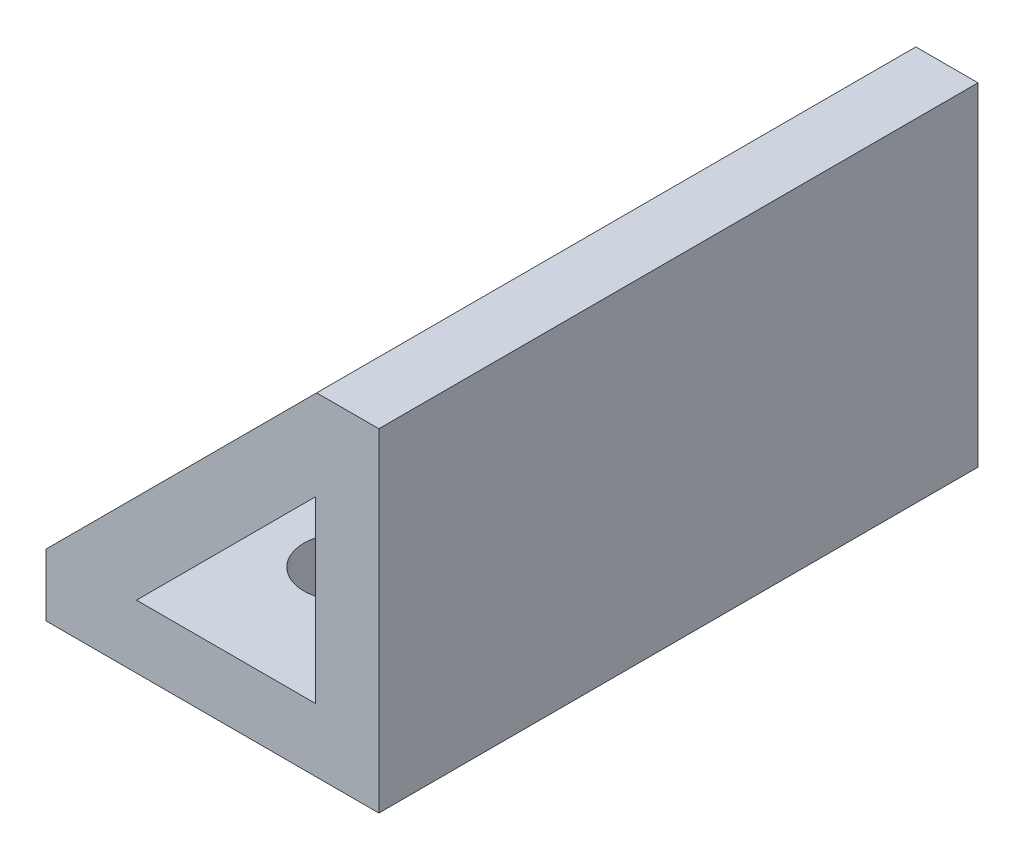
ISO-10303-21;
HEADER;
FILE_DESCRIPTION(('STEP AP214'),'2;1');
FILE_NAME('part.step','',(''),(''),'','','');
FILE_SCHEMA(('AUTOMOTIVE_DESIGN { 1 0 10303 214 1 1 1 1 }'));
ENDSEC;
DATA;
#1=APPLICATION_CONTEXT('core data for automotive mechanical design processes');
#2=APPLICATION_PROTOCOL_DEFINITION('international standard','automotive_design',2000,#1);
#3=PRODUCT_CONTEXT('',#1,'mechanical');
#4=PRODUCT('Part','Part','',(#3));
#5=PRODUCT_RELATED_PRODUCT_CATEGORY('part','',(#4));
#6=PRODUCT_DEFINITION_FORMATION('','',#4);
#7=PRODUCT_DEFINITION_CONTEXT('part definition',#1,'design');
#8=PRODUCT_DEFINITION('design','',#6,#7);
#9=PRODUCT_DEFINITION_SHAPE('','',#8);
#10=(LENGTH_UNIT() NAMED_UNIT(*) SI_UNIT(.MILLI.,.METRE.));
#11=(NAMED_UNIT(*) PLANE_ANGLE_UNIT() SI_UNIT($,.RADIAN.));
#12=(NAMED_UNIT(*) SI_UNIT($,.STERADIAN.) SOLID_ANGLE_UNIT());
#13=UNCERTAINTY_MEASURE_WITH_UNIT(LENGTH_MEASURE(1.E-05),#10,'distance_accuracy_value','');
#14=(GEOMETRIC_REPRESENTATION_CONTEXT(3) GLOBAL_UNCERTAINTY_ASSIGNED_CONTEXT((#13)) GLOBAL_UNIT_ASSIGNED_CONTEXT((#10,
#11,#12)) REPRESENTATION_CONTEXT('',''));
#15=CARTESIAN_POINT('',(0.,0.,0.));
#16=DIRECTION('',(0.,0.,1.));
#17=DIRECTION('',(1.,0.,0.));
#18=AXIS2_PLACEMENT_3D('',#15,#16,#17);
#19=CARTESIAN_POINT('',(0.,0.,45.72));
#20=DIRECTION('',(0.,0.,-1.));
#21=DIRECTION('',(-1.,0.,0.));
#22=AXIS2_PLACEMENT_3D('',#19,#20,#21);
#23=PLANE('',#22);
#24=DIRECTION('',(-1.,0.,0.));
#25=VECTOR('',#24,1.);
#26=CARTESIAN_POINT('',(-4.74541092154095,25.4,45.72));
#27=LINE('',#26,#25);
#28=CARTESIAN_POINT('',(0.,25.4,45.72));
#29=VERTEX_POINT('',#28);
#30=CARTESIAN_POINT('',(-4.74541092154095,25.4,45.72));
#31=VERTEX_POINT('',#30);
#32=EDGE_CURVE('E158',#29,#31,#27,.T.);
#33=ORIENTED_EDGE('',*,*,#32,.T.);
#34=DIRECTION('',(-0.707106781186548,-0.707106781186548,0.));
#35=VECTOR('',#34,1.);
#36=CARTESIAN_POINT('',(-4.74541092154095,25.4,45.72));
#37=LINE('',#36,#35);
#38=CARTESIAN_POINT('',(-25.4,4.74541092154095,45.72));
#39=VERTEX_POINT('',#38);
#40=EDGE_CURVE('E161',#31,#39,#37,.T.);
#41=ORIENTED_EDGE('',*,*,#40,.T.);
#42=DIRECTION('',(0.,-1.,0.));
#43=VECTOR('',#42,1.);
#44=CARTESIAN_POINT('',(-25.4,0.,45.72));
#45=LINE('',#44,#43);
#46=CARTESIAN_POINT('',(-25.4,0.,45.72));
#47=VERTEX_POINT('',#46);
#48=EDGE_CURVE('E164',#39,#47,#45,.T.);
#49=ORIENTED_EDGE('',*,*,#48,.T.);
#50=DIRECTION('',(1.,0.,0.));
#51=VECTOR('',#50,1.);
#52=CARTESIAN_POINT('',(0.,0.,45.72));
#53=LINE('',#52,#51);
#54=CARTESIAN_POINT('',(0.,0.,45.72));
#55=VERTEX_POINT('',#54);
#56=EDGE_CURVE('E166',#47,#55,#53,.T.);
#57=ORIENTED_EDGE('',*,*,#56,.T.);
#58=DIRECTION('',(0.,1.,0.));
#59=VECTOR('',#58,1.);
#60=CARTESIAN_POINT('',(0.,25.4,45.72));
#61=LINE('',#60,#59);
#62=EDGE_CURVE('E168',#55,#29,#61,.T.);
#63=ORIENTED_EDGE('',*,*,#62,.T.);
#64=EDGE_LOOP('',(#33,#41,#49,#57,#63));
#65=FACE_BOUND('',#64,.T.);
#66=DIRECTION('',(-0.707106781186547,-0.707106781186548,0.));
#67=VECTOR('',#66,1.);
#68=CARTESIAN_POINT('',(-18.4944162695284,4.826,45.72));
#69=LINE('',#68,#67);
#70=CARTESIAN_POINT('',(-4.826,18.4944162695284,45.72));
#71=VERTEX_POINT('',#70);
#72=CARTESIAN_POINT('',(-18.4944162695284,4.826,45.72));
#73=VERTEX_POINT('',#72);
#74=EDGE_CURVE('E149',#71,#73,#69,.T.);
#75=ORIENTED_EDGE('',*,*,#74,.F.);
#76=DIRECTION('',(0.,1.,0.));
#77=VECTOR('',#76,1.);
#78=CARTESIAN_POINT('',(-4.826,18.4944162695284,45.72));
#79=LINE('',#78,#77);
#80=CARTESIAN_POINT('',(-4.826,4.826,45.72));
#81=VERTEX_POINT('',#80);
#82=EDGE_CURVE('E145',#81,#71,#79,.T.);
#83=ORIENTED_EDGE('',*,*,#82,.F.);
#84=DIRECTION('',(1.,0.,0.));
#85=VECTOR('',#84,1.);
#86=CARTESIAN_POINT('',(-4.826,4.826,45.72));
#87=LINE('',#86,#85);
#88=EDGE_CURVE('E151',#73,#81,#87,.T.);
#89=ORIENTED_EDGE('',*,*,#88,.F.);
#90=EDGE_LOOP('',(#75,#83,#89));
#91=FACE_BOUND('',#90,.T.);
#92=ADVANCED_FACE('F33',(#65,#91),#23,.F.);
#93=CARTESIAN_POINT('',(0.,0.,0.));
#94=DIRECTION('',(0.,0.,-1.));
#95=DIRECTION('',(-1.,0.,0.));
#96=AXIS2_PLACEMENT_3D('',#93,#94,#95);
#97=PLANE('',#96);
#98=DIRECTION('',(-1.,0.,0.));
#99=VECTOR('',#98,1.);
#100=CARTESIAN_POINT('',(-4.74541092154095,25.4,0.));
#101=LINE('',#100,#99);
#102=CARTESIAN_POINT('',(0.,25.4,0.));
#103=VERTEX_POINT('',#102);
#104=CARTESIAN_POINT('',(-4.74541092154095,25.4,0.));
#105=VERTEX_POINT('',#104);
#106=EDGE_CURVE('E157',#103,#105,#101,.T.);
#107=ORIENTED_EDGE('',*,*,#106,.F.);
#108=DIRECTION('',(0.,1.,0.));
#109=VECTOR('',#108,1.);
#110=CARTESIAN_POINT('',(0.,25.4,0.));
#111=LINE('',#110,#109);
#112=CARTESIAN_POINT('',(0.,0.,0.));
#113=VERTEX_POINT('',#112);
#114=EDGE_CURVE('E162',#113,#103,#111,.T.);
#115=ORIENTED_EDGE('',*,*,#114,.F.);
#116=DIRECTION('',(1.,0.,0.));
#117=VECTOR('',#116,1.);
#118=CARTESIAN_POINT('',(0.,0.,0.));
#119=LINE('',#118,#117);
#120=CARTESIAN_POINT('',(-25.4,0.,0.));
#121=VERTEX_POINT('',#120);
#122=EDGE_CURVE('E177',#121,#113,#119,.T.);
#123=ORIENTED_EDGE('',*,*,#122,.F.);
#124=DIRECTION('',(0.,-1.,0.));
#125=VECTOR('',#124,1.);
#126=CARTESIAN_POINT('',(-25.4,0.,0.));
#127=LINE('',#126,#125);
#128=CARTESIAN_POINT('',(-25.4,4.74541092154095,0.));
#129=VERTEX_POINT('',#128);
#130=EDGE_CURVE('E175',#129,#121,#127,.T.);
#131=ORIENTED_EDGE('',*,*,#130,.F.);
#132=DIRECTION('',(-0.707106781186548,-0.707106781186548,0.));
#133=VECTOR('',#132,1.);
#134=CARTESIAN_POINT('',(-4.74541092154095,25.4,0.));
#135=LINE('',#134,#133);
#136=EDGE_CURVE('E173',#105,#129,#135,.T.);
#137=ORIENTED_EDGE('',*,*,#136,.F.);
#138=EDGE_LOOP('',(#107,#115,#123,#131,#137));
#139=FACE_BOUND('',#138,.T.);
#140=DIRECTION('',(0.,1.,0.));
#141=VECTOR('',#140,1.);
#142=CARTESIAN_POINT('',(-4.826,18.4944162695284,0.));
#143=LINE('',#142,#141);
#144=CARTESIAN_POINT('',(-4.826,4.826,0.));
#145=VERTEX_POINT('',#144);
#146=CARTESIAN_POINT('',(-4.826,18.4944162695284,0.));
#147=VERTEX_POINT('',#146);
#148=EDGE_CURVE('E143',#145,#147,#143,.T.);
#149=ORIENTED_EDGE('',*,*,#148,.T.);
#150=DIRECTION('',(-0.707106781186547,-0.707106781186548,0.));
#151=VECTOR('',#150,1.);
#152=CARTESIAN_POINT('',(-18.4944162695284,4.826,0.));
#153=LINE('',#152,#151);
#154=CARTESIAN_POINT('',(-18.4944162695284,4.826,0.));
#155=VERTEX_POINT('',#154);
#156=EDGE_CURVE('E128',#147,#155,#153,.T.);
#157=ORIENTED_EDGE('',*,*,#156,.T.);
#158=DIRECTION('',(1.,0.,0.));
#159=VECTOR('',#158,1.);
#160=CARTESIAN_POINT('',(-4.826,4.826,0.));
#161=LINE('',#160,#159);
#162=EDGE_CURVE('E137',#155,#145,#161,.T.);
#163=ORIENTED_EDGE('',*,*,#162,.T.);
#164=EDGE_LOOP('',(#149,#157,#163));
#165=FACE_BOUND('',#164,.T.);
#166=ADVANCED_FACE('F148',(#139,#165),#97,.T.);
#167=CARTESIAN_POINT('',(-4.74541092154095,25.4,45.72));
#168=DIRECTION('',(0.,-1.,0.));
#169=DIRECTION('',(0.,0.,-1.));
#170=AXIS2_PLACEMENT_3D('',#167,#168,#169);
#171=PLANE('',#170);
#172=ORIENTED_EDGE('',*,*,#106,.T.);
#173=DIRECTION('',(0.,0.,-1.));
#174=VECTOR('',#173,1.);
#175=CARTESIAN_POINT('',(-4.74541092154095,25.4,45.72));
#176=LINE('',#175,#174);
#177=EDGE_CURVE('E191',#31,#105,#176,.T.);
#178=ORIENTED_EDGE('',*,*,#177,.F.);
#179=ORIENTED_EDGE('',*,*,#32,.F.);
#180=DIRECTION('',(0.,0.,-1.));
#181=VECTOR('',#180,1.);
#182=CARTESIAN_POINT('',(0.,25.4,45.72));
#183=LINE('',#182,#181);
#184=EDGE_CURVE('E170',#29,#103,#183,.T.);
#185=ORIENTED_EDGE('',*,*,#184,.T.);
#186=EDGE_LOOP('',(#172,#178,#179,#185));
#187=FACE_BOUND('',#186,.T.);
#188=ADVANCED_FACE('F35',(#187),#171,.F.);
#189=CARTESIAN_POINT('',(-4.74541092154095,25.4,45.72));
#190=DIRECTION('',(0.707106781186548,-0.707106781186548,0.));
#191=DIRECTION('',(0.707106781186548,0.707106781186548,0.));
#192=AXIS2_PLACEMENT_3D('',#189,#190,#191);
#193=PLANE('',#192);
#194=CARTESIAN_POINT('',(-12.7,17.4454109215409,35.56));
#195=DIRECTION('',(0.707106781186548,-0.707106781186548,0.));
#196=DIRECTION('',(0.707106781186548,0.707106781186548,0.));
#197=AXIS2_PLACEMENT_3D('',#194,#195,#196);
#198=ELLIPSE('',#197,8.98025612106915,6.35);
#199=CARTESIAN_POINT('',(-6.35,23.795410921541,35.56));
#200=VERTEX_POINT('',#199);
#201=EDGE_CURVE('E114',#200,#200,#198,.T.);
#202=ORIENTED_EDGE('',*,*,#201,.T.);
#203=EDGE_LOOP('',(#202));
#204=FACE_BOUND('',#203,.T.);
#205=CARTESIAN_POINT('',(-12.7,17.4454109215409,10.16));
#206=DIRECTION('',(0.707106781186548,-0.707106781186548,0.));
#207=DIRECTION('',(0.707106781186548,0.707106781186548,0.));
#208=AXIS2_PLACEMENT_3D('',#205,#206,#207);
#209=ELLIPSE('',#208,8.98025612106915,6.35);
#210=CARTESIAN_POINT('',(-6.35,23.795410921541,10.16));
#211=VERTEX_POINT('',#210);
#212=EDGE_CURVE('E250',#211,#211,#209,.T.);
#213=ORIENTED_EDGE('',*,*,#212,.T.);
#214=EDGE_LOOP('',(#213));
#215=FACE_BOUND('',#214,.T.);
#216=ORIENTED_EDGE('',*,*,#136,.T.);
#217=DIRECTION('',(0.,0.,-1.));
#218=VECTOR('',#217,1.);
#219=CARTESIAN_POINT('',(-25.4,4.74541092154095,45.72));
#220=LINE('',#219,#218);
#221=EDGE_CURVE('E188',#39,#129,#220,.T.);
#222=ORIENTED_EDGE('',*,*,#221,.F.);
#223=ORIENTED_EDGE('',*,*,#40,.F.);
#224=ORIENTED_EDGE('',*,*,#177,.T.);
#225=EDGE_LOOP('',(#216,#222,#223,#224));
#226=FACE_BOUND('',#225,.T.);
#227=ADVANCED_FACE('F236',(#204,#215,#226),#193,.F.);
#228=CARTESIAN_POINT('',(-25.4,0.,45.72));
#229=DIRECTION('',(1.,0.,0.));
#230=DIRECTION('',(0.,0.,-1.));
#231=AXIS2_PLACEMENT_3D('',#228,#229,#230);
#232=PLANE('',#231);
#233=ORIENTED_EDGE('',*,*,#130,.T.);
#234=DIRECTION('',(0.,0.,-1.));
#235=VECTOR('',#234,1.);
#236=CARTESIAN_POINT('',(-25.4,0.,45.72));
#237=LINE('',#236,#235);
#238=EDGE_CURVE('E185',#47,#121,#237,.T.);
#239=ORIENTED_EDGE('',*,*,#238,.F.);
#240=ORIENTED_EDGE('',*,*,#48,.F.);
#241=ORIENTED_EDGE('',*,*,#221,.T.);
#242=EDGE_LOOP('',(#233,#239,#240,#241));
#243=FACE_BOUND('',#242,.T.);
#244=ADVANCED_FACE('F233',(#243),#232,.F.);
#245=CARTESIAN_POINT('',(0.,0.,45.72));
#246=DIRECTION('',(0.,1.,0.));
#247=DIRECTION('',(0.,0.,1.));
#248=AXIS2_PLACEMENT_3D('',#245,#246,#247);
#249=PLANE('',#248);
#250=CARTESIAN_POINT('',(-12.7,0.,10.16));
#251=DIRECTION('',(0.,-1.,0.));
#252=DIRECTION('',(0.,0.,-1.));
#253=AXIS2_PLACEMENT_3D('',#250,#251,#252);
#254=CIRCLE('',#253,3.175);
#255=CARTESIAN_POINT('',(-12.7,0.,6.98499999999999));
#256=VERTEX_POINT('',#255);
#257=EDGE_CURVE('E201',#256,#256,#254,.T.);
#258=ORIENTED_EDGE('',*,*,#257,.F.);
#259=EDGE_LOOP('',(#258));
#260=FACE_BOUND('',#259,.T.);
#261=CARTESIAN_POINT('',(-12.7,0.,35.56));
#262=DIRECTION('',(0.,-1.,0.));
#263=DIRECTION('',(0.,0.,-1.));
#264=AXIS2_PLACEMENT_3D('',#261,#262,#263);
#265=CIRCLE('',#264,3.175);
#266=CARTESIAN_POINT('',(-12.7,0.,32.385));
#267=VERTEX_POINT('',#266);
#268=EDGE_CURVE('E197',#267,#267,#265,.T.);
#269=ORIENTED_EDGE('',*,*,#268,.F.);
#270=EDGE_LOOP('',(#269));
#271=FACE_BOUND('',#270,.T.);
#272=ORIENTED_EDGE('',*,*,#122,.T.);
#273=DIRECTION('',(0.,0.,-1.));
#274=VECTOR('',#273,1.);
#275=CARTESIAN_POINT('',(0.,0.,45.72));
#276=LINE('',#275,#274);
#277=EDGE_CURVE('E182',#55,#113,#276,.T.);
#278=ORIENTED_EDGE('',*,*,#277,.F.);
#279=ORIENTED_EDGE('',*,*,#56,.F.);
#280=ORIENTED_EDGE('',*,*,#238,.T.);
#281=EDGE_LOOP('',(#272,#278,#279,#280));
#282=FACE_BOUND('',#281,.T.);
#283=ADVANCED_FACE('F229',(#260,#271,#282),#249,.F.);
#284=CARTESIAN_POINT('',(0.,25.4,45.72));
#285=DIRECTION('',(-1.,0.,0.));
#286=DIRECTION('',(0.,-1.,0.));
#287=AXIS2_PLACEMENT_3D('',#284,#285,#286);
#288=PLANE('',#287);
#289=ORIENTED_EDGE('',*,*,#114,.T.);
#290=ORIENTED_EDGE('',*,*,#184,.F.);
#291=ORIENTED_EDGE('',*,*,#62,.F.);
#292=ORIENTED_EDGE('',*,*,#277,.T.);
#293=EDGE_LOOP('',(#289,#290,#291,#292));
#294=FACE_BOUND('',#293,.T.);
#295=ADVANCED_FACE('F120',(#294),#288,.F.);
#296=CARTESIAN_POINT('',(-18.4944162695284,4.826,45.72));
#297=DIRECTION('',(0.707106781186548,-0.707106781186547,0.));
#298=DIRECTION('',(0.707106781186547,0.707106781186548,0.));
#299=AXIS2_PLACEMENT_3D('',#296,#297,#298);
#300=PLANE('',#299);
#301=CARTESIAN_POINT('',(-12.7,10.6204162695284,35.56));
#302=DIRECTION('',(0.707106781186548,-0.707106781186547,0.));
#303=DIRECTION('',(0.707106781186547,0.707106781186548,0.));
#304=AXIS2_PLACEMENT_3D('',#301,#302,#303);
#305=ELLIPSE('',#304,8.98025612106916,6.35);
#306=CARTESIAN_POINT('',(-16.9704162695284,6.35,30.8604207757558));
#307=VERTEX_POINT('',#306);
#308=CARTESIAN_POINT('',(-16.9704162695284,6.35,40.2595792242441));
#309=VERTEX_POINT('',#308);
#310=EDGE_CURVE('E11',#307,#309,#305,.T.);
#311=ORIENTED_EDGE('',*,*,#310,.F.);
#312=DIRECTION('',(0.,0.,1.));
#313=VECTOR('',#312,1.);
#314=CARTESIAN_POINT('',(-16.9704162695284,6.35,45.72));
#315=LINE('',#314,#313);
#316=EDGE_CURVE('E41',#307,#309,#315,.T.);
#317=ORIENTED_EDGE('',*,*,#316,.T.);
#318=EDGE_LOOP('',(#311,#317));
#319=FACE_BOUND('',#318,.T.);
#320=CARTESIAN_POINT('',(-12.7,10.6204162695284,10.16));
#321=DIRECTION('',(0.707106781186548,-0.707106781186547,0.));
#322=DIRECTION('',(0.707106781186547,0.707106781186548,0.));
#323=AXIS2_PLACEMENT_3D('',#320,#321,#322);
#324=ELLIPSE('',#323,8.98025612106916,6.35);
#325=CARTESIAN_POINT('',(-16.9704162695284,6.35,5.46042077575585));
#326=VERTEX_POINT('',#325);
#327=CARTESIAN_POINT('',(-16.9704162695284,6.35,14.8595792242441));
#328=VERTEX_POINT('',#327);
#329=EDGE_CURVE('E110',#326,#328,#324,.T.);
#330=ORIENTED_EDGE('',*,*,#329,.F.);
#331=DIRECTION('',(0.,0.,1.));
#332=VECTOR('',#331,1.);
#333=CARTESIAN_POINT('',(-16.9704162695284,6.35,45.72));
#334=LINE('',#333,#332);
#335=EDGE_CURVE('E194',#326,#328,#334,.T.);
#336=ORIENTED_EDGE('',*,*,#335,.T.);
#337=EDGE_LOOP('',(#330,#336));
#338=FACE_BOUND('',#337,.T.);
#339=ORIENTED_EDGE('',*,*,#156,.F.);
#340=DIRECTION('',(0.,0.,-1.));
#341=VECTOR('',#340,1.);
#342=CARTESIAN_POINT('',(-4.826,18.4944162695284,45.72));
#343=LINE('',#342,#341);
#344=EDGE_CURVE('E130',#71,#147,#343,.T.);
#345=ORIENTED_EDGE('',*,*,#344,.F.);
#346=ORIENTED_EDGE('',*,*,#74,.T.);
#347=DIRECTION('',(0.,0.,-1.));
#348=VECTOR('',#347,1.);
#349=CARTESIAN_POINT('',(-18.4944162695284,4.826,45.72));
#350=LINE('',#349,#348);
#351=EDGE_CURVE('E133',#73,#155,#350,.T.);
#352=ORIENTED_EDGE('',*,*,#351,.T.);
#353=EDGE_LOOP('',(#339,#345,#346,#352));
#354=FACE_BOUND('',#353,.T.);
#355=ADVANCED_FACE('F116',(#319,#338,#354),#300,.T.);
#356=CARTESIAN_POINT('',(-4.826,4.826,45.72));
#357=DIRECTION('',(0.,1.,0.));
#358=DIRECTION('',(-1.,0.,0.));
#359=AXIS2_PLACEMENT_3D('',#356,#357,#358);
#360=PLANE('',#359);
#361=CARTESIAN_POINT('',(-12.7,4.826,10.16));
#362=DIRECTION('',(0.,1.,0.));
#363=DIRECTION('',(-1.,0.,0.));
#364=AXIS2_PLACEMENT_3D('',#361,#362,#363);
#365=CIRCLE('',#364,3.175);
#366=CARTESIAN_POINT('',(-15.875,4.826,10.16));
#367=VERTEX_POINT('',#366);
#368=EDGE_CURVE('E198',#367,#367,#365,.T.);
#369=ORIENTED_EDGE('',*,*,#368,.F.);
#370=EDGE_LOOP('',(#369));
#371=FACE_BOUND('',#370,.T.);
#372=CARTESIAN_POINT('',(-12.7,4.826,35.56));
#373=DIRECTION('',(0.,1.,0.));
#374=DIRECTION('',(-1.,0.,0.));
#375=AXIS2_PLACEMENT_3D('',#372,#373,#374);
#376=CIRCLE('',#375,3.175);
#377=CARTESIAN_POINT('',(-15.875,4.826,35.56));
#378=VERTEX_POINT('',#377);
#379=EDGE_CURVE('E138',#378,#378,#376,.T.);
#380=ORIENTED_EDGE('',*,*,#379,.F.);
#381=EDGE_LOOP('',(#380));
#382=FACE_BOUND('',#381,.T.);
#383=ORIENTED_EDGE('',*,*,#162,.F.);
#384=ORIENTED_EDGE('',*,*,#351,.F.);
#385=ORIENTED_EDGE('',*,*,#88,.T.);
#386=DIRECTION('',(0.,0.,-1.));
#387=VECTOR('',#386,1.);
#388=CARTESIAN_POINT('',(-4.826,4.826,45.72));
#389=LINE('',#388,#387);
#390=EDGE_CURVE('E146',#81,#145,#389,.T.);
#391=ORIENTED_EDGE('',*,*,#390,.T.);
#392=EDGE_LOOP('',(#383,#384,#385,#391));
#393=FACE_BOUND('',#392,.T.);
#394=ADVANCED_FACE('F119',(#371,#382,#393),#360,.T.);
#395=CARTESIAN_POINT('',(-4.826,18.4944162695284,45.72));
#396=DIRECTION('',(-1.,0.,0.));
#397=DIRECTION('',(0.,-1.,0.));
#398=AXIS2_PLACEMENT_3D('',#395,#396,#397);
#399=PLANE('',#398);
#400=ORIENTED_EDGE('',*,*,#148,.F.);
#401=ORIENTED_EDGE('',*,*,#390,.F.);
#402=ORIENTED_EDGE('',*,*,#82,.T.);
#403=ORIENTED_EDGE('',*,*,#344,.T.);
#404=EDGE_LOOP('',(#400,#401,#402,#403));
#405=FACE_BOUND('',#404,.T.);
#406=ADVANCED_FACE('F142',(#405),#399,.T.);
#407=CARTESIAN_POINT('',(-12.7,25.4,35.56));
#408=DIRECTION('',(0.,-1.,0.));
#409=DIRECTION('',(0.,0.,-1.));
#410=AXIS2_PLACEMENT_3D('',#407,#408,#409);
#411=CYLINDRICAL_SURFACE('',#410,3.175);
#412=ORIENTED_EDGE('',*,*,#379,.T.);
#413=EDGE_LOOP('',(#412));
#414=FACE_BOUND('',#413,.T.);
#415=ORIENTED_EDGE('',*,*,#268,.T.);
#416=EDGE_LOOP('',(#415));
#417=FACE_BOUND('',#416,.T.);
#418=ADVANCED_FACE('F282',(#414,#417),#411,.F.);
#419=CARTESIAN_POINT('',(-12.7,25.4,10.16));
#420=DIRECTION('',(0.,-1.,0.));
#421=DIRECTION('',(0.,0.,-1.));
#422=AXIS2_PLACEMENT_3D('',#419,#420,#421);
#423=CYLINDRICAL_SURFACE('',#422,3.175);
#424=ORIENTED_EDGE('',*,*,#368,.T.);
#425=EDGE_LOOP('',(#424));
#426=FACE_BOUND('',#425,.T.);
#427=ORIENTED_EDGE('',*,*,#257,.T.);
#428=EDGE_LOOP('',(#427));
#429=FACE_BOUND('',#428,.T.);
#430=ADVANCED_FACE('F214',(#426,#429),#423,.F.);
#431=CARTESIAN_POINT('',(-12.7,6.35,10.16));
#432=DIRECTION('',(0.,1.,0.));
#433=DIRECTION('',(0.,0.,1.));
#434=AXIS2_PLACEMENT_3D('',#431,#432,#433);
#435=CYLINDRICAL_SURFACE('',#434,6.35);
#436=ORIENTED_EDGE('',*,*,#329,.T.);
#437=CARTESIAN_POINT('',(-12.7,6.35,10.16));
#438=DIRECTION('',(0.,1.,0.));
#439=DIRECTION('',(0.,0.,1.));
#440=AXIS2_PLACEMENT_3D('',#437,#438,#439);
#441=CIRCLE('',#440,6.35);
#442=EDGE_CURVE('E53',#326,#328,#441,.T.);
#443=ORIENTED_EDGE('',*,*,#442,.F.);
#444=EDGE_LOOP('',(#436,#443));
#445=FACE_BOUND('',#444,.T.);
#446=ORIENTED_EDGE('',*,*,#212,.F.);
#447=EDGE_LOOP('',(#446));
#448=FACE_BOUND('',#447,.T.);
#449=ADVANCED_FACE('F204',(#445,#448),#435,.F.);
#450=CARTESIAN_POINT('',(-12.7,6.35,10.16));
#451=DIRECTION('',(0.,1.,0.));
#452=DIRECTION('',(0.,0.,1.));
#453=AXIS2_PLACEMENT_3D('',#450,#451,#452);
#454=PLANE('',#453);
#455=ORIENTED_EDGE('',*,*,#442,.T.);
#456=ORIENTED_EDGE('',*,*,#335,.F.);
#457=EDGE_LOOP('',(#455,#456));
#458=FACE_BOUND('',#457,.T.);
#459=ADVANCED_FACE('F206',(#458),#454,.T.);
#460=CARTESIAN_POINT('',(-12.7,6.35,35.56));
#461=DIRECTION('',(0.,1.,0.));
#462=DIRECTION('',(0.,0.,1.));
#463=AXIS2_PLACEMENT_3D('',#460,#461,#462);
#464=CYLINDRICAL_SURFACE('',#463,6.35);
#465=ORIENTED_EDGE('',*,*,#310,.T.);
#466=CARTESIAN_POINT('',(-12.7,6.35,35.56));
#467=DIRECTION('',(0.,1.,0.));
#468=DIRECTION('',(0.,0.,1.));
#469=AXIS2_PLACEMENT_3D('',#466,#467,#468);
#470=CIRCLE('',#469,6.35);
#471=EDGE_CURVE('E47',#307,#309,#470,.T.);
#472=ORIENTED_EDGE('',*,*,#471,.F.);
#473=EDGE_LOOP('',(#465,#472));
#474=FACE_BOUND('',#473,.T.);
#475=ORIENTED_EDGE('',*,*,#201,.F.);
#476=EDGE_LOOP('',(#475));
#477=FACE_BOUND('',#476,.T.);
#478=ADVANCED_FACE('F112',(#474,#477),#464,.F.);
#479=CARTESIAN_POINT('',(-12.7,6.35,35.56));
#480=DIRECTION('',(0.,1.,0.));
#481=DIRECTION('',(0.,0.,1.));
#482=AXIS2_PLACEMENT_3D('',#479,#480,#481);
#483=PLANE('',#482);
#484=ORIENTED_EDGE('',*,*,#471,.T.);
#485=ORIENTED_EDGE('',*,*,#316,.F.);
#486=EDGE_LOOP('',(#484,#485));
#487=FACE_BOUND('',#486,.T.);
#488=ADVANCED_FACE('F107',(#487),#483,.T.);
#489=CLOSED_SHELL('',(#92,#166,#188,#227,#244,#283,#295,#355,#394,#406,#418,#430,#449,#459,#478,#488));
#490=MANIFOLD_SOLID_BREP('B2',#489);
#491=ADVANCED_BREP_SHAPE_REPRESENTATION('',(#18,#490),#14);
#492=SHAPE_DEFINITION_REPRESENTATION(#9,#491);
ENDSEC;
END-ISO-10303-21;
